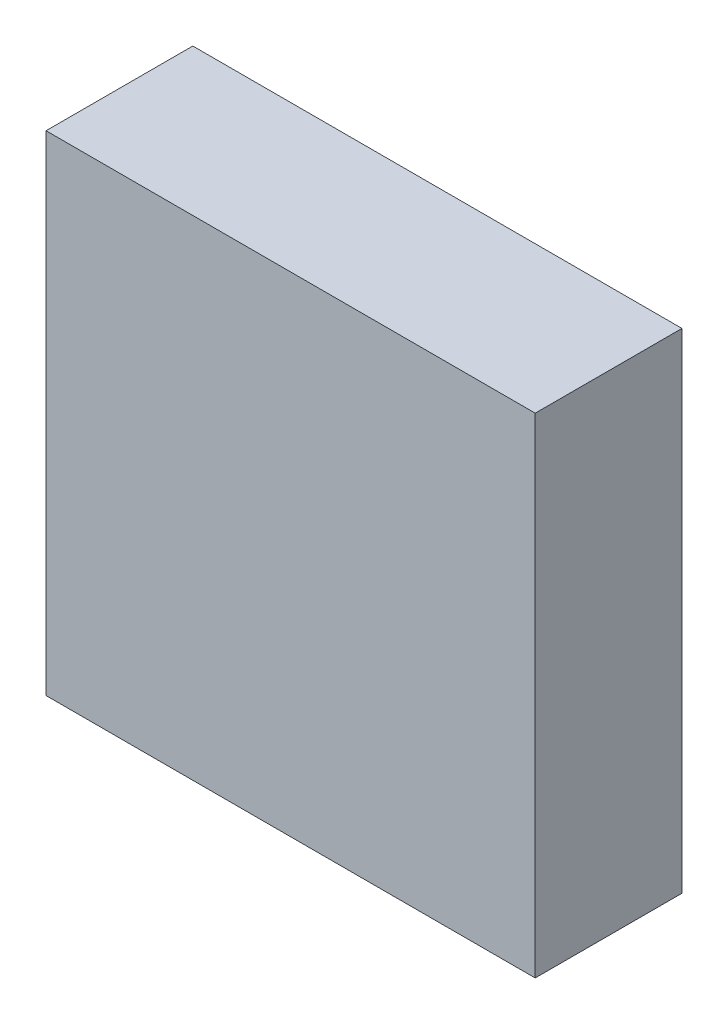
ISO-10303-21;
HEADER;
FILE_DESCRIPTION(('STEP AP214'),'2;1');
FILE_NAME('part.step','',(''),(''),'','','');
FILE_SCHEMA(('AUTOMOTIVE_DESIGN { 1 0 10303 214 1 1 1 1 }'));
ENDSEC;
DATA;
#1=APPLICATION_CONTEXT('core data for automotive mechanical design processes');
#2=APPLICATION_PROTOCOL_DEFINITION('international standard','automotive_design',2000,#1);
#3=PRODUCT_CONTEXT('',#1,'mechanical');
#4=PRODUCT('Part','Part','',(#3));
#5=PRODUCT_RELATED_PRODUCT_CATEGORY('part','',(#4));
#6=PRODUCT_DEFINITION_FORMATION('','',#4);
#7=PRODUCT_DEFINITION_CONTEXT('part definition',#1,'design');
#8=PRODUCT_DEFINITION('design','',#6,#7);
#9=PRODUCT_DEFINITION_SHAPE('','',#8);
#10=(LENGTH_UNIT() NAMED_UNIT(*) SI_UNIT(.MILLI.,.METRE.));
#11=(NAMED_UNIT(*) PLANE_ANGLE_UNIT() SI_UNIT($,.RADIAN.));
#12=(NAMED_UNIT(*) SI_UNIT($,.STERADIAN.) SOLID_ANGLE_UNIT());
#13=UNCERTAINTY_MEASURE_WITH_UNIT(LENGTH_MEASURE(1.E-05),#10,'distance_accuracy_value','');
#14=(GEOMETRIC_REPRESENTATION_CONTEXT(3) GLOBAL_UNCERTAINTY_ASSIGNED_CONTEXT((#13)) GLOBAL_UNIT_ASSIGNED_CONTEXT((#10,
#11,#12)) REPRESENTATION_CONTEXT('',''));
#15=CARTESIAN_POINT('',(0.,0.,0.));
#16=DIRECTION('',(0.,0.,1.));
#17=DIRECTION('',(1.,0.,0.));
#18=AXIS2_PLACEMENT_3D('',#15,#16,#17);
#19=CARTESIAN_POINT('',(-7.76124141762908,11.057268722467,6.));
#20=DIRECTION('',(1.,0.,0.));
#21=DIRECTION('',(0.,1.,0.));
#22=AXIS2_PLACEMENT_3D('',#19,#20,#21);
#23=PLANE('',#22);
#24=DIRECTION('',(0.,-1.,0.));
#25=VECTOR('',#24,1.);
#26=CARTESIAN_POINT('',(-7.76124141762908,11.057268722467,0.));
#27=LINE('',#26,#25);
#28=CARTESIAN_POINT('',(-7.76124141762908,11.057268722467,0.));
#29=VERTEX_POINT('',#28);
#30=CARTESIAN_POINT('',(-7.76124141762908,-8.94273127753303,0.));
#31=VERTEX_POINT('',#30);
#32=EDGE_CURVE('E96',#29,#31,#27,.T.);
#33=ORIENTED_EDGE('',*,*,#32,.T.);
#34=DIRECTION('',(0.,0.,-1.));
#35=VECTOR('',#34,1.);
#36=CARTESIAN_POINT('',(-7.76124141762908,-8.94273127753303,6.));
#37=LINE('',#36,#35);
#38=CARTESIAN_POINT('',(-7.76124141762908,-8.94273127753303,6.));
#39=VERTEX_POINT('',#38);
#40=EDGE_CURVE('E11',#39,#31,#37,.T.);
#41=ORIENTED_EDGE('',*,*,#40,.F.);
#42=DIRECTION('',(0.,-1.,0.));
#43=VECTOR('',#42,1.);
#44=CARTESIAN_POINT('',(-7.76124141762908,11.057268722467,6.));
#45=LINE('',#44,#43);
#46=CARTESIAN_POINT('',(-7.76124141762908,11.057268722467,6.));
#47=VERTEX_POINT('',#46);
#48=EDGE_CURVE('E84',#47,#39,#45,.T.);
#49=ORIENTED_EDGE('',*,*,#48,.F.);
#50=DIRECTION('',(0.,0.,-1.));
#51=VECTOR('',#50,1.);
#52=CARTESIAN_POINT('',(-7.76124141762908,11.057268722467,6.));
#53=LINE('',#52,#51);
#54=EDGE_CURVE('E92',#47,#29,#53,.T.);
#55=ORIENTED_EDGE('',*,*,#54,.T.);
#56=EDGE_LOOP('',(#33,#41,#49,#55));
#57=FACE_BOUND('',#56,.T.);
#58=ADVANCED_FACE('F33',(#57),#23,.F.);
#59=CARTESIAN_POINT('',(-7.76124141762908,-8.94273127753303,6.));
#60=DIRECTION('',(0.,1.,0.));
#61=DIRECTION('',(0.,0.,1.));
#62=AXIS2_PLACEMENT_3D('',#59,#60,#61);
#63=PLANE('',#62);
#64=DIRECTION('',(1.,0.,0.));
#65=VECTOR('',#64,1.);
#66=CARTESIAN_POINT('',(-7.76124141762908,-8.94273127753303,0.));
#67=LINE('',#66,#65);
#68=CARTESIAN_POINT('',(12.2387585823709,-8.94273127753303,0.));
#69=VERTEX_POINT('',#68);
#70=EDGE_CURVE('E88',#31,#69,#67,.T.);
#71=ORIENTED_EDGE('',*,*,#70,.T.);
#72=DIRECTION('',(0.,0.,-1.));
#73=VECTOR('',#72,1.);
#74=CARTESIAN_POINT('',(12.2387585823709,-8.94273127753303,6.));
#75=LINE('',#74,#73);
#76=CARTESIAN_POINT('',(12.2387585823709,-8.94273127753303,6.));
#77=VERTEX_POINT('',#76);
#78=EDGE_CURVE('E41',#77,#69,#75,.T.);
#79=ORIENTED_EDGE('',*,*,#78,.F.);
#80=DIRECTION('',(1.,0.,0.));
#81=VECTOR('',#80,1.);
#82=CARTESIAN_POINT('',(-7.76124141762908,-8.94273127753303,6.));
#83=LINE('',#82,#81);
#84=EDGE_CURVE('E79',#39,#77,#83,.T.);
#85=ORIENTED_EDGE('',*,*,#84,.F.);
#86=ORIENTED_EDGE('',*,*,#40,.T.);
#87=EDGE_LOOP('',(#71,#79,#85,#86));
#88=FACE_BOUND('',#87,.T.);
#89=ADVANCED_FACE('F87',(#88),#63,.F.);
#90=CARTESIAN_POINT('',(12.2387585823709,11.057268722467,6.));
#91=DIRECTION('',(-1.,0.,0.));
#92=DIRECTION('',(0.,-1.,0.));
#93=AXIS2_PLACEMENT_3D('',#90,#91,#92);
#94=PLANE('',#93);
#95=DIRECTION('',(0.,1.,0.));
#96=VECTOR('',#95,1.);
#97=CARTESIAN_POINT('',(12.2387585823709,11.057268722467,0.));
#98=LINE('',#97,#96);
#99=CARTESIAN_POINT('',(12.2387585823709,11.057268722467,0.));
#100=VERTEX_POINT('',#99);
#101=EDGE_CURVE('E66',#69,#100,#98,.T.);
#102=ORIENTED_EDGE('',*,*,#101,.T.);
#103=DIRECTION('',(0.,0.,-1.));
#104=VECTOR('',#103,1.);
#105=CARTESIAN_POINT('',(12.2387585823709,11.057268722467,6.));
#106=LINE('',#105,#104);
#107=CARTESIAN_POINT('',(12.2387585823709,11.057268722467,6.));
#108=VERTEX_POINT('',#107);
#109=EDGE_CURVE('E89',#108,#100,#106,.T.);
#110=ORIENTED_EDGE('',*,*,#109,.F.);
#111=DIRECTION('',(0.,1.,0.));
#112=VECTOR('',#111,1.);
#113=CARTESIAN_POINT('',(12.2387585823709,11.057268722467,6.));
#114=LINE('',#113,#112);
#115=EDGE_CURVE('E82',#77,#108,#114,.T.);
#116=ORIENTED_EDGE('',*,*,#115,.F.);
#117=ORIENTED_EDGE('',*,*,#78,.T.);
#118=EDGE_LOOP('',(#102,#110,#116,#117));
#119=FACE_BOUND('',#118,.T.);
#120=ADVANCED_FACE('F90',(#119),#94,.F.);
#121=CARTESIAN_POINT('',(-7.76124141762908,11.057268722467,6.));
#122=DIRECTION('',(0.,-1.,0.));
#123=DIRECTION('',(0.,0.,-1.));
#124=AXIS2_PLACEMENT_3D('',#121,#122,#123);
#125=PLANE('',#124);
#126=DIRECTION('',(-1.,0.,0.));
#127=VECTOR('',#126,1.);
#128=CARTESIAN_POINT('',(-7.76124141762908,11.057268722467,0.));
#129=LINE('',#128,#127);
#130=EDGE_CURVE('E72',#100,#29,#129,.T.);
#131=ORIENTED_EDGE('',*,*,#130,.T.);
#132=ORIENTED_EDGE('',*,*,#54,.F.);
#133=DIRECTION('',(-1.,0.,0.));
#134=VECTOR('',#133,1.);
#135=CARTESIAN_POINT('',(-7.76124141762908,11.057268722467,6.));
#136=LINE('',#135,#134);
#137=EDGE_CURVE('E49',#108,#47,#136,.T.);
#138=ORIENTED_EDGE('',*,*,#137,.F.);
#139=ORIENTED_EDGE('',*,*,#109,.T.);
#140=EDGE_LOOP('',(#131,#132,#138,#139));
#141=FACE_BOUND('',#140,.T.);
#142=ADVANCED_FACE('F103',(#141),#125,.F.);
#143=CARTESIAN_POINT('',(0.,0.,6.));
#144=DIRECTION('',(0.,0.,1.));
#145=DIRECTION('',(1.,0.,0.));
#146=AXIS2_PLACEMENT_3D('',#143,#144,#145);
#147=PLANE('',#146);
#148=ORIENTED_EDGE('',*,*,#48,.T.);
#149=ORIENTED_EDGE('',*,*,#84,.T.);
#150=ORIENTED_EDGE('',*,*,#115,.T.);
#151=ORIENTED_EDGE('',*,*,#137,.T.);
#152=EDGE_LOOP('',(#148,#149,#150,#151));
#153=FACE_BOUND('',#152,.T.);
#154=ADVANCED_FACE('F80',(#153),#147,.T.);
#155=CARTESIAN_POINT('',(0.,0.,0.));
#156=DIRECTION('',(0.,0.,1.));
#157=DIRECTION('',(1.,0.,0.));
#158=AXIS2_PLACEMENT_3D('',#155,#156,#157);
#159=PLANE('',#158);
#160=ORIENTED_EDGE('',*,*,#32,.F.);
#161=ORIENTED_EDGE('',*,*,#130,.F.);
#162=ORIENTED_EDGE('',*,*,#101,.F.);
#163=ORIENTED_EDGE('',*,*,#70,.F.);
#164=EDGE_LOOP('',(#160,#161,#162,#163));
#165=FACE_BOUND('',#164,.T.);
#166=ADVANCED_FACE('F106',(#165),#159,.F.);
#167=CLOSED_SHELL('',(#58,#89,#120,#142,#154,#166));
#168=MANIFOLD_SOLID_BREP('B2',#167);
#169=ADVANCED_BREP_SHAPE_REPRESENTATION('',(#18,#168),#14);
#170=SHAPE_DEFINITION_REPRESENTATION(#9,#169);
ENDSEC;
END-ISO-10303-21;
